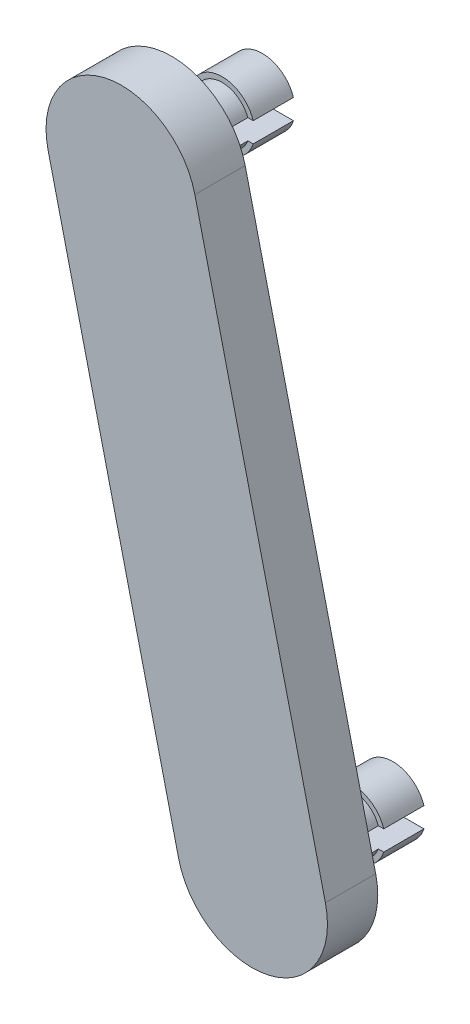
ISO-10303-21;
HEADER;
FILE_DESCRIPTION(('STEP AP214'),'2;1');
FILE_NAME('part.step','',(''),(''),'','','');
FILE_SCHEMA(('AUTOMOTIVE_DESIGN { 1 0 10303 214 1 1 1 1 }'));
ENDSEC;
DATA;
#1=APPLICATION_CONTEXT('core data for automotive mechanical design processes');
#2=APPLICATION_PROTOCOL_DEFINITION('international standard','automotive_design',2000,#1);
#3=PRODUCT_CONTEXT('',#1,'mechanical');
#4=PRODUCT('Part','Part','',(#3));
#5=PRODUCT_RELATED_PRODUCT_CATEGORY('part','',(#4));
#6=PRODUCT_DEFINITION_FORMATION('','',#4);
#7=PRODUCT_DEFINITION_CONTEXT('part definition',#1,'design');
#8=PRODUCT_DEFINITION('design','',#6,#7);
#9=PRODUCT_DEFINITION_SHAPE('','',#8);
#10=(LENGTH_UNIT() NAMED_UNIT(*) SI_UNIT(.MILLI.,.METRE.));
#11=(NAMED_UNIT(*) PLANE_ANGLE_UNIT() SI_UNIT($,.RADIAN.));
#12=(NAMED_UNIT(*) SI_UNIT($,.STERADIAN.) SOLID_ANGLE_UNIT());
#13=UNCERTAINTY_MEASURE_WITH_UNIT(LENGTH_MEASURE(1.E-05),#10,'distance_accuracy_value','');
#14=(GEOMETRIC_REPRESENTATION_CONTEXT(3) GLOBAL_UNCERTAINTY_ASSIGNED_CONTEXT((#13)) GLOBAL_UNIT_ASSIGNED_CONTEXT((#10,
#11,#12)) REPRESENTATION_CONTEXT('',''));
#15=CARTESIAN_POINT('',(0.,0.,0.));
#16=DIRECTION('',(0.,0.,1.));
#17=DIRECTION('',(1.,0.,0.));
#18=AXIS2_PLACEMENT_3D('',#15,#16,#17);
#19=CARTESIAN_POINT('',(-117.560209615445,12.3494325880028,-5.));
#20=DIRECTION('',(0.,0.,1.));
#21=DIRECTION('',(1.,0.,0.));
#22=AXIS2_PLACEMENT_3D('',#19,#20,#21);
#23=CYLINDRICAL_SURFACE('',#22,2.75000000000001);
#24=DIRECTION('',(0.,0.,1.));
#25=VECTOR('',#24,1.);
#26=CARTESIAN_POINT('',(-120.121947306934,13.3494325880028,-5.));
#27=LINE('',#26,#25);
#28=CARTESIAN_POINT('',(-120.121947306934,13.3494325880028,0.));
#29=VERTEX_POINT('',#28);
#30=CARTESIAN_POINT('',(-120.121947306934,13.3494325880028,-5.));
#31=VERTEX_POINT('',#30);
#32=EDGE_CURVE('E194',#29,#31,#27,.F.);
#33=ORIENTED_EDGE('',*,*,#32,.F.);
#34=CARTESIAN_POINT('',(-117.560209615445,12.3494325880028,0.));
#35=DIRECTION('',(0.,0.,1.));
#36=DIRECTION('',(1.,0.,0.));
#37=AXIS2_PLACEMENT_3D('',#34,#35,#36);
#38=CIRCLE('',#37,2.75000000000001);
#39=CARTESIAN_POINT('',(-114.998471923955,13.3494325880028,0.));
#40=VERTEX_POINT('',#39);
#41=EDGE_CURVE('E224',#40,#29,#38,.T.);
#42=ORIENTED_EDGE('',*,*,#41,.F.);
#43=DIRECTION('',(0.,0.,1.));
#44=VECTOR('',#43,1.);
#45=CARTESIAN_POINT('',(-114.998471923955,13.3494325880028,-5.));
#46=LINE('',#45,#44);
#47=CARTESIAN_POINT('',(-114.998471923955,13.3494325880028,-5.));
#48=VERTEX_POINT('',#47);
#49=EDGE_CURVE('E305',#48,#40,#46,.T.);
#50=ORIENTED_EDGE('',*,*,#49,.F.);
#51=CARTESIAN_POINT('',(-117.560209615445,12.3494325880028,-5.));
#52=DIRECTION('',(0.,0.,1.));
#53=DIRECTION('',(1.,0.,0.));
#54=AXIS2_PLACEMENT_3D('',#51,#52,#53);
#55=CIRCLE('',#54,2.75000000000001);
#56=EDGE_CURVE('E221',#48,#31,#55,.T.);
#57=ORIENTED_EDGE('',*,*,#56,.T.);
#58=EDGE_LOOP('',(#33,#42,#50,#57));
#59=FACE_BOUND('',#58,.T.);
#60=ADVANCED_FACE('F37',(#59),#23,.T.);
#61=CARTESIAN_POINT('',(-104.585156134855,-42.1266905043745,-5.));
#62=DIRECTION('',(0.,0.,1.));
#63=DIRECTION('',(1.,0.,0.));
#64=AXIS2_PLACEMENT_3D('',#61,#62,#63);
#65=CYLINDRICAL_SURFACE('',#64,2.75000000000001);
#66=DIRECTION('',(0.,0.,1.));
#67=VECTOR('',#66,1.);
#68=CARTESIAN_POINT('',(-107.146893826345,-41.1266905043745,-5.));
#69=LINE('',#68,#67);
#70=CARTESIAN_POINT('',(-107.146893826345,-41.1266905043745,0.));
#71=VERTEX_POINT('',#70);
#72=CARTESIAN_POINT('',(-107.146893826345,-41.1266905043745,-5.));
#73=VERTEX_POINT('',#72);
#74=EDGE_CURVE('E282',#71,#73,#69,.F.);
#75=ORIENTED_EDGE('',*,*,#74,.F.);
#76=CARTESIAN_POINT('',(-104.585156134855,-42.1266905043745,0.));
#77=DIRECTION('',(0.,0.,1.));
#78=DIRECTION('',(1.,0.,0.));
#79=AXIS2_PLACEMENT_3D('',#76,#77,#78);
#80=CIRCLE('',#79,2.75000000000001);
#81=CARTESIAN_POINT('',(-102.023418443365,-41.1266905043745,0.));
#82=VERTEX_POINT('',#81);
#83=EDGE_CURVE('E212',#82,#71,#80,.T.);
#84=ORIENTED_EDGE('',*,*,#83,.F.);
#85=DIRECTION('',(0.,0.,1.));
#86=VECTOR('',#85,1.);
#87=CARTESIAN_POINT('',(-102.023418443365,-41.1266905043745,-5.));
#88=LINE('',#87,#86);
#89=CARTESIAN_POINT('',(-102.023418443365,-41.1266905043745,-5.));
#90=VERTEX_POINT('',#89);
#91=EDGE_CURVE('E283',#90,#82,#88,.T.);
#92=ORIENTED_EDGE('',*,*,#91,.F.);
#93=CARTESIAN_POINT('',(-104.585156134855,-42.1266905043745,-5.));
#94=DIRECTION('',(0.,0.,1.));
#95=DIRECTION('',(1.,0.,0.));
#96=AXIS2_PLACEMENT_3D('',#93,#94,#95);
#97=CIRCLE('',#96,2.75000000000001);
#98=EDGE_CURVE('E217',#90,#73,#97,.T.);
#99=ORIENTED_EDGE('',*,*,#98,.T.);
#100=EDGE_LOOP('',(#75,#84,#92,#99));
#101=FACE_BOUND('',#100,.T.);
#102=ADVANCED_FACE('F280',(#101),#65,.T.);
#103=CARTESIAN_POINT('',(-117.560209615445,12.3494325880028,-9.));
#104=DIRECTION('',(0.,0.,1.));
#105=DIRECTION('',(1.,0.,0.));
#106=AXIS2_PLACEMENT_3D('',#103,#104,#105);
#107=CYLINDRICAL_SURFACE('',#106,3.25000000000001);
#108=CARTESIAN_POINT('',(-117.560209615445,12.3494325880028,-9.));
#109=DIRECTION('',(0.,0.,-1.));
#110=DIRECTION('',(-1.,0.,0.));
#111=AXIS2_PLACEMENT_3D('',#108,#109,#110);
#112=CIRCLE('',#111,3.25000000000001);
#113=CARTESIAN_POINT('',(-120.652538834658,13.3494325880028,-9.));
#114=VERTEX_POINT('',#113);
#115=CARTESIAN_POINT('',(-114.467880396231,13.3494325880028,-9.));
#116=VERTEX_POINT('',#115);
#117=EDGE_CURVE('E203',#114,#116,#112,.T.);
#118=ORIENTED_EDGE('',*,*,#117,.F.);
#119=DIRECTION('',(0.,0.,1.));
#120=VECTOR('',#119,1.);
#121=CARTESIAN_POINT('',(-120.652538834658,13.3494325880028,-9.));
#122=LINE('',#121,#120);
#123=CARTESIAN_POINT('',(-120.652538834658,13.3494325880028,-5.));
#124=VERTEX_POINT('',#123);
#125=EDGE_CURVE('E198',#114,#124,#122,.T.);
#126=ORIENTED_EDGE('',*,*,#125,.T.);
#127=CARTESIAN_POINT('',(-117.560209615445,12.3494325880028,-5.));
#128=DIRECTION('',(0.,0.,-1.));
#129=DIRECTION('',(-1.,0.,0.));
#130=AXIS2_PLACEMENT_3D('',#127,#128,#129);
#131=CIRCLE('',#130,3.25000000000001);
#132=CARTESIAN_POINT('',(-114.467880396231,13.3494325880028,-5.));
#133=VERTEX_POINT('',#132);
#134=EDGE_CURVE('E208',#124,#133,#131,.T.);
#135=ORIENTED_EDGE('',*,*,#134,.T.);
#136=DIRECTION('',(0.,0.,1.));
#137=VECTOR('',#136,1.);
#138=CARTESIAN_POINT('',(-114.467880396231,13.3494325880028,-9.));
#139=LINE('',#138,#137);
#140=EDGE_CURVE('E302',#133,#116,#139,.F.);
#141=ORIENTED_EDGE('',*,*,#140,.T.);
#142=EDGE_LOOP('',(#118,#126,#135,#141));
#143=FACE_BOUND('',#142,.T.);
#144=ADVANCED_FACE('F311',(#143),#107,.T.);
#145=CARTESIAN_POINT('',(-117.560209615445,12.3494325880028,-9.));
#146=DIRECTION('',(0.,0.,-1.));
#147=DIRECTION('',(-1.,0.,0.));
#148=AXIS2_PLACEMENT_3D('',#145,#146,#147);
#149=PLANE('',#148);
#150=DIRECTION('',(1.,0.,0.));
#151=VECTOR('',#150,1.);
#152=CARTESIAN_POINT('',(-112.560209615444,13.3494325880028,-9.));
#153=LINE('',#152,#151);
#154=EDGE_CURVE('E331',#114,#116,#153,.T.);
#155=ORIENTED_EDGE('',*,*,#154,.F.);
#156=ORIENTED_EDGE('',*,*,#117,.T.);
#157=EDGE_LOOP('',(#155,#156));
#158=FACE_BOUND('',#157,.T.);
#159=ADVANCED_FACE('F371',(#158),#149,.T.);
#160=CARTESIAN_POINT('',(-117.560209615445,12.3494325880028,-5.));
#161=DIRECTION('',(0.,0.,-1.));
#162=DIRECTION('',(-1.,0.,0.));
#163=AXIS2_PLACEMENT_3D('',#160,#161,#162);
#164=PLANE('',#163);
#165=ORIENTED_EDGE('',*,*,#134,.F.);
#166=DIRECTION('',(1.,0.,0.));
#167=VECTOR('',#166,1.);
#168=CARTESIAN_POINT('',(-117.560209615445,13.3494325880028,-5.));
#169=LINE('',#168,#167);
#170=EDGE_CURVE('E11',#124,#31,#169,.T.);
#171=ORIENTED_EDGE('',*,*,#170,.T.);
#172=ORIENTED_EDGE('',*,*,#56,.F.);
#173=EDGE_CURVE('E41',#48,#133,#169,.T.);
#174=ORIENTED_EDGE('',*,*,#173,.T.);
#175=EDGE_LOOP('',(#165,#171,#172,#174));
#176=FACE_BOUND('',#175,.T.);
#177=ADVANCED_FACE('F316',(#176),#164,.F.);
#178=CARTESIAN_POINT('',(-104.585156134855,-42.1266905043745,-9.));
#179=DIRECTION('',(0.,0.,1.));
#180=DIRECTION('',(1.,0.,0.));
#181=AXIS2_PLACEMENT_3D('',#178,#179,#180);
#182=CYLINDRICAL_SURFACE('',#181,3.25000000000001);
#183=CARTESIAN_POINT('',(-104.585156134855,-42.1266905043745,-9.));
#184=DIRECTION('',(0.,0.,-1.));
#185=DIRECTION('',(-1.,0.,0.));
#186=AXIS2_PLACEMENT_3D('',#183,#184,#185);
#187=CIRCLE('',#186,3.25000000000001);
#188=CARTESIAN_POINT('',(-107.677485354068,-41.1266905043745,-9.));
#189=VERTEX_POINT('',#188);
#190=CARTESIAN_POINT('',(-101.492826915642,-41.1266905043745,-9.));
#191=VERTEX_POINT('',#190);
#192=EDGE_CURVE('E193',#189,#191,#187,.T.);
#193=ORIENTED_EDGE('',*,*,#192,.F.);
#194=DIRECTION('',(0.,0.,1.));
#195=VECTOR('',#194,1.);
#196=CARTESIAN_POINT('',(-107.677485354068,-41.1266905043745,-9.));
#197=LINE('',#196,#195);
#198=CARTESIAN_POINT('',(-107.677485354068,-41.1266905043745,-5.));
#199=VERTEX_POINT('',#198);
#200=EDGE_CURVE('E285',#189,#199,#197,.T.);
#201=ORIENTED_EDGE('',*,*,#200,.T.);
#202=CARTESIAN_POINT('',(-104.585156134855,-42.1266905043745,-5.));
#203=DIRECTION('',(0.,0.,-1.));
#204=DIRECTION('',(-1.,0.,0.));
#205=AXIS2_PLACEMENT_3D('',#202,#203,#204);
#206=CIRCLE('',#205,3.25000000000001);
#207=CARTESIAN_POINT('',(-101.492826915642,-41.1266905043745,-5.));
#208=VERTEX_POINT('',#207);
#209=EDGE_CURVE('E202',#199,#208,#206,.T.);
#210=ORIENTED_EDGE('',*,*,#209,.T.);
#211=DIRECTION('',(0.,0.,1.));
#212=VECTOR('',#211,1.);
#213=CARTESIAN_POINT('',(-101.492826915642,-41.1266905043745,-9.));
#214=LINE('',#213,#212);
#215=EDGE_CURVE('E286',#208,#191,#214,.F.);
#216=ORIENTED_EDGE('',*,*,#215,.T.);
#217=EDGE_LOOP('',(#193,#201,#210,#216));
#218=FACE_BOUND('',#217,.T.);
#219=ADVANCED_FACE('F352',(#218),#182,.T.);
#220=CARTESIAN_POINT('',(-104.585156134855,-42.1266905043745,-9.));
#221=DIRECTION('',(0.,0.,-1.));
#222=DIRECTION('',(-1.,0.,0.));
#223=AXIS2_PLACEMENT_3D('',#220,#221,#222);
#224=PLANE('',#223);
#225=DIRECTION('',(1.,0.,0.));
#226=VECTOR('',#225,1.);
#227=CARTESIAN_POINT('',(-99.5851561348551,-41.1266905043745,-9.));
#228=LINE('',#227,#226);
#229=EDGE_CURVE('E189',#189,#191,#228,.T.);
#230=ORIENTED_EDGE('',*,*,#229,.F.);
#231=ORIENTED_EDGE('',*,*,#192,.T.);
#232=EDGE_LOOP('',(#230,#231));
#233=FACE_BOUND('',#232,.T.);
#234=ADVANCED_FACE('F356',(#233),#224,.T.);
#235=CARTESIAN_POINT('',(-104.585156134855,-42.1266905043745,-5.));
#236=DIRECTION('',(0.,0.,-1.));
#237=DIRECTION('',(-1.,0.,0.));
#238=AXIS2_PLACEMENT_3D('',#235,#236,#237);
#239=PLANE('',#238);
#240=ORIENTED_EDGE('',*,*,#209,.F.);
#241=DIRECTION('',(1.,0.,0.));
#242=VECTOR('',#241,1.);
#243=CARTESIAN_POINT('',(-104.585156134855,-41.1266905043745,-5.));
#244=LINE('',#243,#242);
#245=EDGE_CURVE('E261',#199,#73,#244,.T.);
#246=ORIENTED_EDGE('',*,*,#245,.T.);
#247=ORIENTED_EDGE('',*,*,#98,.F.);
#248=EDGE_CURVE('E259',#90,#208,#244,.T.);
#249=ORIENTED_EDGE('',*,*,#248,.T.);
#250=EDGE_LOOP('',(#240,#246,#247,#249));
#251=FACE_BOUND('',#250,.T.);
#252=ADVANCED_FACE('F273',(#251),#239,.F.);
#253=CARTESIAN_POINT('',(-104.585156134855,-42.1266905043745,5.));
#254=DIRECTION('',(0.,0.,-1.));
#255=DIRECTION('',(-1.,0.,0.));
#256=AXIS2_PLACEMENT_3D('',#253,#254,#255);
#257=CYLINDRICAL_SURFACE('',#256,7.50000000000001);
#258=CARTESIAN_POINT('',(-104.585156134855,-42.1266905043745,0.));
#259=DIRECTION('',(0.,0.,1.));
#260=DIRECTION('',(1.,0.,0.));
#261=AXIS2_PLACEMENT_3D('',#258,#259,#260);
#262=CIRCLE('',#261,7.50000000000001);
#263=CARTESIAN_POINT('',(-111.881065477584,-43.8644208812392,0.));
#264=VERTEX_POINT('',#263);
#265=CARTESIAN_POINT('',(-97.289246792126,-40.3889601275099,0.));
#266=VERTEX_POINT('',#265);
#267=EDGE_CURVE('E227',#264,#266,#262,.T.);
#268=ORIENTED_EDGE('',*,*,#267,.T.);
#269=DIRECTION('',(0.,0.,-1.));
#270=VECTOR('',#269,1.);
#271=CARTESIAN_POINT('',(-97.289246792126,-40.3889601275099,5.));
#272=LINE('',#271,#270);
#273=CARTESIAN_POINT('',(-97.289246792126,-40.3889601275099,5.));
#274=VERTEX_POINT('',#273);
#275=EDGE_CURVE('E254',#274,#266,#272,.T.);
#276=ORIENTED_EDGE('',*,*,#275,.F.);
#277=CARTESIAN_POINT('',(-104.585156134855,-42.1266905043745,5.));
#278=DIRECTION('',(0.,0.,1.));
#279=DIRECTION('',(1.,0.,0.));
#280=AXIS2_PLACEMENT_3D('',#277,#278,#279);
#281=CIRCLE('',#280,7.50000000000001);
#282=CARTESIAN_POINT('',(-111.881065477584,-43.8644208812392,5.));
#283=VERTEX_POINT('',#282);
#284=EDGE_CURVE('E228',#283,#274,#281,.T.);
#285=ORIENTED_EDGE('',*,*,#284,.F.);
#286=DIRECTION('',(0.,0.,-1.));
#287=VECTOR('',#286,1.);
#288=CARTESIAN_POINT('',(-111.881065477584,-43.8644208812392,5.));
#289=LINE('',#288,#287);
#290=EDGE_CURVE('E238',#283,#264,#289,.T.);
#291=ORIENTED_EDGE('',*,*,#290,.T.);
#292=EDGE_LOOP('',(#268,#276,#285,#291));
#293=FACE_BOUND('',#292,.T.);
#294=ADVANCED_FACE('F39',(#293),#257,.T.);
#295=CARTESIAN_POINT('',(-97.289246792126,-40.3889601275099,5.));
#296=DIRECTION('',(-0.972787912363881,-0.231697383581953,0.));
#297=DIRECTION('',(0.231697383581953,-0.972787912363881,0.));
#298=AXIS2_PLACEMENT_3D('',#295,#296,#297);
#299=PLANE('',#298);
#300=DIRECTION('',(-0.231697383581953,0.972787912363881,0.));
#301=VECTOR('',#300,1.);
#302=CARTESIAN_POINT('',(-97.289246792126,-40.3889601275099,0.));
#303=LINE('',#302,#301);
#304=CARTESIAN_POINT('',(-110.264300272715,14.0871629648674,0.));
#305=VERTEX_POINT('',#304);
#306=EDGE_CURVE('E241',#266,#305,#303,.T.);
#307=ORIENTED_EDGE('',*,*,#306,.T.);
#308=DIRECTION('',(0.,0.,-1.));
#309=VECTOR('',#308,1.);
#310=CARTESIAN_POINT('',(-110.264300272715,14.0871629648674,5.));
#311=LINE('',#310,#309);
#312=CARTESIAN_POINT('',(-110.264300272715,14.0871629648674,5.));
#313=VERTEX_POINT('',#312);
#314=EDGE_CURVE('E251',#313,#305,#311,.T.);
#315=ORIENTED_EDGE('',*,*,#314,.F.);
#316=DIRECTION('',(-0.231697383581953,0.972787912363881,0.));
#317=VECTOR('',#316,1.);
#318=CARTESIAN_POINT('',(-97.289246792126,-40.3889601275099,5.));
#319=LINE('',#318,#317);
#320=EDGE_CURVE('E231',#274,#313,#319,.T.);
#321=ORIENTED_EDGE('',*,*,#320,.F.);
#322=ORIENTED_EDGE('',*,*,#275,.T.);
#323=EDGE_LOOP('',(#307,#315,#321,#322));
#324=FACE_BOUND('',#323,.T.);
#325=ADVANCED_FACE('F420',(#324),#299,.F.);
#326=CARTESIAN_POINT('',(-117.560209615445,12.3494325880028,5.));
#327=DIRECTION('',(0.,0.,-1.));
#328=DIRECTION('',(-1.,0.,0.));
#329=AXIS2_PLACEMENT_3D('',#326,#327,#328);
#330=CYLINDRICAL_SURFACE('',#329,7.5);
#331=CARTESIAN_POINT('',(-117.560209615445,12.3494325880028,0.));
#332=DIRECTION('',(0.,0.,1.));
#333=DIRECTION('',(1.,0.,0.));
#334=AXIS2_PLACEMENT_3D('',#331,#332,#333);
#335=CIRCLE('',#334,7.5);
#336=CARTESIAN_POINT('',(-124.856118958174,10.6117022111381,0.));
#337=VERTEX_POINT('',#336);
#338=EDGE_CURVE('E243',#305,#337,#335,.T.);
#339=ORIENTED_EDGE('',*,*,#338,.T.);
#340=DIRECTION('',(0.,0.,-1.));
#341=VECTOR('',#340,1.);
#342=CARTESIAN_POINT('',(-124.856118958174,10.6117022111381,5.));
#343=LINE('',#342,#341);
#344=CARTESIAN_POINT('',(-124.856118958174,10.6117022111381,5.));
#345=VERTEX_POINT('',#344);
#346=EDGE_CURVE('E248',#345,#337,#343,.T.);
#347=ORIENTED_EDGE('',*,*,#346,.F.);
#348=CARTESIAN_POINT('',(-117.560209615445,12.3494325880028,5.));
#349=DIRECTION('',(0.,0.,1.));
#350=DIRECTION('',(1.,0.,0.));
#351=AXIS2_PLACEMENT_3D('',#348,#349,#350);
#352=CIRCLE('',#351,7.5);
#353=EDGE_CURVE('E234',#313,#345,#352,.T.);
#354=ORIENTED_EDGE('',*,*,#353,.F.);
#355=ORIENTED_EDGE('',*,*,#314,.T.);
#356=EDGE_LOOP('',(#339,#347,#354,#355));
#357=FACE_BOUND('',#356,.T.);
#358=ADVANCED_FACE('F417',(#357),#330,.T.);
#359=CARTESIAN_POINT('',(-111.881065477584,-43.8644208812392,5.));
#360=DIRECTION('',(0.972787912363881,0.231697383581953,0.));
#361=DIRECTION('',(-0.231697383581953,0.972787912363881,0.));
#362=AXIS2_PLACEMENT_3D('',#359,#360,#361);
#363=PLANE('',#362);
#364=DIRECTION('',(0.231697383581953,-0.972787912363881,0.));
#365=VECTOR('',#364,1.);
#366=CARTESIAN_POINT('',(-111.881065477584,-43.8644208812392,0.));
#367=LINE('',#366,#365);
#368=EDGE_CURVE('E232',#337,#264,#367,.T.);
#369=ORIENTED_EDGE('',*,*,#368,.T.);
#370=ORIENTED_EDGE('',*,*,#290,.F.);
#371=DIRECTION('',(0.231697383581953,-0.972787912363881,0.));
#372=VECTOR('',#371,1.);
#373=CARTESIAN_POINT('',(-111.881065477584,-43.8644208812392,5.));
#374=LINE('',#373,#372);
#375=EDGE_CURVE('E236',#345,#283,#374,.T.);
#376=ORIENTED_EDGE('',*,*,#375,.F.);
#377=ORIENTED_EDGE('',*,*,#346,.T.);
#378=EDGE_LOOP('',(#369,#370,#376,#377));
#379=FACE_BOUND('',#378,.T.);
#380=ADVANCED_FACE('F413',(#379),#363,.F.);
#381=CARTESIAN_POINT('',(-104.585156134855,-42.1266905043745,5.));
#382=DIRECTION('',(0.,0.,1.));
#383=DIRECTION('',(1.,0.,0.));
#384=AXIS2_PLACEMENT_3D('',#381,#382,#383);
#385=PLANE('',#384);
#386=ORIENTED_EDGE('',*,*,#284,.T.);
#387=ORIENTED_EDGE('',*,*,#320,.T.);
#388=ORIENTED_EDGE('',*,*,#353,.T.);
#389=ORIENTED_EDGE('',*,*,#375,.T.);
#390=EDGE_LOOP('',(#386,#387,#388,#389));
#391=FACE_BOUND('',#390,.T.);
#392=ADVANCED_FACE('F395',(#391),#385,.T.);
#393=CARTESIAN_POINT('',(-104.585156134855,-42.1266905043745,0.));
#394=DIRECTION('',(0.,0.,1.));
#395=DIRECTION('',(1.,0.,0.));
#396=AXIS2_PLACEMENT_3D('',#393,#394,#395);
#397=PLANE('',#396);
#398=DIRECTION('',(1.,0.,0.));
#399=VECTOR('',#398,1.);
#400=CARTESIAN_POINT('',(-99.5851561348551,-41.1266905043745,0.));
#401=LINE('',#400,#399);
#402=EDGE_CURVE('E337',#71,#82,#401,.T.);
#403=ORIENTED_EDGE('',*,*,#402,.T.);
#404=ORIENTED_EDGE('',*,*,#83,.T.);
#405=EDGE_LOOP('',(#403,#404));
#406=FACE_BOUND('',#405,.T.);
#407=DIRECTION('',(-1.,0.,0.));
#408=VECTOR('',#407,1.);
#409=CARTESIAN_POINT('',(-99.5851561348551,-43.1266905043745,0.));
#410=LINE('',#409,#408);
#411=CARTESIAN_POINT('',(-102.023418443365,-43.1266905043745,0.));
#412=VERTEX_POINT('',#411);
#413=CARTESIAN_POINT('',(-107.146893826345,-43.1266905043745,0.));
#414=VERTEX_POINT('',#413);
#415=EDGE_CURVE('E340',#412,#414,#410,.T.);
#416=ORIENTED_EDGE('',*,*,#415,.T.);
#417=EDGE_CURVE('E216',#414,#412,#80,.T.);
#418=ORIENTED_EDGE('',*,*,#417,.T.);
#419=EDGE_LOOP('',(#416,#418));
#420=FACE_BOUND('',#419,.T.);
#421=DIRECTION('',(1.,0.,0.));
#422=VECTOR('',#421,1.);
#423=CARTESIAN_POINT('',(-112.560209615444,13.3494325880028,0.));
#424=LINE('',#423,#422);
#425=EDGE_CURVE('E327',#29,#40,#424,.T.);
#426=ORIENTED_EDGE('',*,*,#425,.T.);
#427=ORIENTED_EDGE('',*,*,#41,.T.);
#428=EDGE_LOOP('',(#426,#427));
#429=FACE_BOUND('',#428,.T.);
#430=DIRECTION('',(-1.,0.,0.));
#431=VECTOR('',#430,1.);
#432=CARTESIAN_POINT('',(-112.560209615444,11.3494325880028,0.));
#433=LINE('',#432,#431);
#434=CARTESIAN_POINT('',(-114.998471923955,11.3494325880028,0.));
#435=VERTEX_POINT('',#434);
#436=CARTESIAN_POINT('',(-120.121947306934,11.3494325880028,0.));
#437=VERTEX_POINT('',#436);
#438=EDGE_CURVE('E328',#435,#437,#433,.T.);
#439=ORIENTED_EDGE('',*,*,#438,.T.);
#440=EDGE_CURVE('E215',#437,#435,#38,.T.);
#441=ORIENTED_EDGE('',*,*,#440,.T.);
#442=EDGE_LOOP('',(#439,#441));
#443=FACE_BOUND('',#442,.T.);
#444=ORIENTED_EDGE('',*,*,#267,.F.);
#445=ORIENTED_EDGE('',*,*,#368,.F.);
#446=ORIENTED_EDGE('',*,*,#338,.F.);
#447=ORIENTED_EDGE('',*,*,#306,.F.);
#448=EDGE_LOOP('',(#444,#445,#446,#447));
#449=FACE_BOUND('',#448,.T.);
#450=ADVANCED_FACE('F325',(#406,#420,#429,#443,#449),#397,.F.);
#451=DIRECTION('',(0.,0.,1.));
#452=VECTOR('',#451,1.);
#453=CARTESIAN_POINT('',(-114.998471923955,11.3494325880028,-5.));
#454=LINE('',#453,#452);
#455=CARTESIAN_POINT('',(-114.998471923955,11.3494325880028,-5.));
#456=VERTEX_POINT('',#455);
#457=EDGE_CURVE('E300',#435,#456,#454,.F.);
#458=ORIENTED_EDGE('',*,*,#457,.F.);
#459=ORIENTED_EDGE('',*,*,#440,.F.);
#460=DIRECTION('',(0.,0.,1.));
#461=VECTOR('',#460,1.);
#462=CARTESIAN_POINT('',(-120.121947306934,11.3494325880028,-5.));
#463=LINE('',#462,#461);
#464=CARTESIAN_POINT('',(-120.121947306934,11.3494325880028,-5.));
#465=VERTEX_POINT('',#464);
#466=EDGE_CURVE('E295',#465,#437,#463,.T.);
#467=ORIENTED_EDGE('',*,*,#466,.F.);
#468=EDGE_CURVE('E206',#465,#456,#55,.T.);
#469=ORIENTED_EDGE('',*,*,#468,.T.);
#470=EDGE_LOOP('',(#458,#459,#467,#469));
#471=FACE_BOUND('',#470,.T.);
#472=ADVANCED_FACE('F383',(#471),#23,.T.);
#473=DIRECTION('',(0.,0.,1.));
#474=VECTOR('',#473,1.);
#475=CARTESIAN_POINT('',(-102.023418443365,-43.1266905043745,-5.));
#476=LINE('',#475,#474);
#477=CARTESIAN_POINT('',(-102.023418443365,-43.1266905043745,-5.));
#478=VERTEX_POINT('',#477);
#479=EDGE_CURVE('E182',#412,#478,#476,.F.);
#480=ORIENTED_EDGE('',*,*,#479,.F.);
#481=ORIENTED_EDGE('',*,*,#417,.F.);
#482=DIRECTION('',(0.,0.,1.));
#483=VECTOR('',#482,1.);
#484=CARTESIAN_POINT('',(-107.146893826345,-43.1266905043745,-5.));
#485=LINE('',#484,#483);
#486=CARTESIAN_POINT('',(-107.146893826345,-43.1266905043745,-5.));
#487=VERTEX_POINT('',#486);
#488=EDGE_CURVE('E183',#487,#414,#485,.T.);
#489=ORIENTED_EDGE('',*,*,#488,.F.);
#490=EDGE_CURVE('E220',#487,#478,#97,.T.);
#491=ORIENTED_EDGE('',*,*,#490,.T.);
#492=EDGE_LOOP('',(#480,#481,#489,#491));
#493=FACE_BOUND('',#492,.T.);
#494=ADVANCED_FACE('F349',(#493),#65,.T.);
#495=CARTESIAN_POINT('',(-114.467880396231,11.3494325880028,-9.));
#496=VERTEX_POINT('',#495);
#497=CARTESIAN_POINT('',(-120.652538834658,11.3494325880028,-9.));
#498=VERTEX_POINT('',#497);
#499=EDGE_CURVE('E207',#496,#498,#112,.T.);
#500=ORIENTED_EDGE('',*,*,#499,.F.);
#501=DIRECTION('',(0.,0.,1.));
#502=VECTOR('',#501,1.);
#503=CARTESIAN_POINT('',(-114.467880396231,11.3494325880028,-9.));
#504=LINE('',#503,#502);
#505=CARTESIAN_POINT('',(-114.467880396231,11.3494325880028,-5.));
#506=VERTEX_POINT('',#505);
#507=EDGE_CURVE('E297',#496,#506,#504,.T.);
#508=ORIENTED_EDGE('',*,*,#507,.T.);
#509=CARTESIAN_POINT('',(-120.652538834658,11.3494325880028,-5.));
#510=VERTEX_POINT('',#509);
#511=EDGE_CURVE('E211',#506,#510,#131,.T.);
#512=ORIENTED_EDGE('',*,*,#511,.T.);
#513=DIRECTION('',(0.,0.,1.));
#514=VECTOR('',#513,1.);
#515=CARTESIAN_POINT('',(-120.652538834658,11.3494325880028,-9.));
#516=LINE('',#515,#514);
#517=EDGE_CURVE('E52',#510,#498,#516,.F.);
#518=ORIENTED_EDGE('',*,*,#517,.T.);
#519=EDGE_LOOP('',(#500,#508,#512,#518));
#520=FACE_BOUND('',#519,.T.);
#521=ADVANCED_FACE('F366',(#520),#107,.T.);
#522=DIRECTION('',(-1.,0.,0.));
#523=VECTOR('',#522,1.);
#524=CARTESIAN_POINT('',(-112.560209615444,11.3494325880028,-9.));
#525=LINE('',#524,#523);
#526=EDGE_CURVE('E190',#496,#498,#525,.T.);
#527=ORIENTED_EDGE('',*,*,#526,.F.);
#528=ORIENTED_EDGE('',*,*,#499,.T.);
#529=EDGE_LOOP('',(#527,#528));
#530=FACE_BOUND('',#529,.T.);
#531=ADVANCED_FACE('F367',(#530),#149,.T.);
#532=ORIENTED_EDGE('',*,*,#511,.F.);
#533=DIRECTION('',(-1.,0.,0.));
#534=VECTOR('',#533,1.);
#535=CARTESIAN_POINT('',(-117.560209615445,11.3494325880028,-5.));
#536=LINE('',#535,#534);
#537=EDGE_CURVE('E263',#506,#456,#536,.T.);
#538=ORIENTED_EDGE('',*,*,#537,.T.);
#539=ORIENTED_EDGE('',*,*,#468,.F.);
#540=EDGE_CURVE('E262',#465,#510,#536,.T.);
#541=ORIENTED_EDGE('',*,*,#540,.T.);
#542=EDGE_LOOP('',(#532,#538,#539,#541));
#543=FACE_BOUND('',#542,.T.);
#544=ADVANCED_FACE('F369',(#543),#164,.F.);
#545=CARTESIAN_POINT('',(-101.492826915642,-43.1266905043745,-9.));
#546=VERTEX_POINT('',#545);
#547=CARTESIAN_POINT('',(-107.677485354068,-43.1266905043745,-9.));
#548=VERTEX_POINT('',#547);
#549=EDGE_CURVE('E188',#546,#548,#187,.T.);
#550=ORIENTED_EDGE('',*,*,#549,.F.);
#551=DIRECTION('',(0.,0.,1.));
#552=VECTOR('',#551,1.);
#553=CARTESIAN_POINT('',(-101.492826915642,-43.1266905043745,-9.));
#554=LINE('',#553,#552);
#555=CARTESIAN_POINT('',(-101.492826915642,-43.1266905043745,-5.));
#556=VERTEX_POINT('',#555);
#557=EDGE_CURVE('E172',#546,#556,#554,.T.);
#558=ORIENTED_EDGE('',*,*,#557,.T.);
#559=CARTESIAN_POINT('',(-107.677485354068,-43.1266905043745,-5.));
#560=VERTEX_POINT('',#559);
#561=EDGE_CURVE('E197',#556,#560,#206,.T.);
#562=ORIENTED_EDGE('',*,*,#561,.T.);
#563=DIRECTION('',(0.,0.,1.));
#564=VECTOR('',#563,1.);
#565=CARTESIAN_POINT('',(-107.677485354068,-43.1266905043745,-9.));
#566=LINE('',#565,#564);
#567=EDGE_CURVE('E60',#560,#548,#566,.F.);
#568=ORIENTED_EDGE('',*,*,#567,.T.);
#569=EDGE_LOOP('',(#550,#558,#562,#568));
#570=FACE_BOUND('',#569,.T.);
#571=ADVANCED_FACE('F192',(#570),#182,.T.);
#572=DIRECTION('',(-1.,0.,0.));
#573=VECTOR('',#572,1.);
#574=CARTESIAN_POINT('',(-99.5851561348551,-43.1266905043745,-9.));
#575=LINE('',#574,#573);
#576=EDGE_CURVE('E175',#546,#548,#575,.T.);
#577=ORIENTED_EDGE('',*,*,#576,.F.);
#578=ORIENTED_EDGE('',*,*,#549,.T.);
#579=EDGE_LOOP('',(#577,#578));
#580=FACE_BOUND('',#579,.T.);
#581=ADVANCED_FACE('F187',(#580),#224,.T.);
#582=ORIENTED_EDGE('',*,*,#561,.F.);
#583=DIRECTION('',(-1.,0.,0.));
#584=VECTOR('',#583,1.);
#585=CARTESIAN_POINT('',(-104.585156134855,-43.1266905043745,-5.));
#586=LINE('',#585,#584);
#587=EDGE_CURVE('E177',#556,#478,#586,.T.);
#588=ORIENTED_EDGE('',*,*,#587,.T.);
#589=ORIENTED_EDGE('',*,*,#490,.F.);
#590=EDGE_CURVE('E257',#487,#560,#586,.T.);
#591=ORIENTED_EDGE('',*,*,#590,.T.);
#592=EDGE_LOOP('',(#582,#588,#589,#591));
#593=FACE_BOUND('',#592,.T.);
#594=ADVANCED_FACE('F347',(#593),#239,.F.);
#595=CARTESIAN_POINT('',(-99.5851561348551,-41.1266905043745,0.));
#596=DIRECTION('',(0.,1.,0.));
#597=DIRECTION('',(0.,0.,1.));
#598=AXIS2_PLACEMENT_3D('',#595,#596,#597);
#599=PLANE('',#598);
#600=ORIENTED_EDGE('',*,*,#74,.T.);
#601=ORIENTED_EDGE('',*,*,#245,.F.);
#602=ORIENTED_EDGE('',*,*,#200,.F.);
#603=ORIENTED_EDGE('',*,*,#229,.T.);
#604=ORIENTED_EDGE('',*,*,#215,.F.);
#605=ORIENTED_EDGE('',*,*,#248,.F.);
#606=ORIENTED_EDGE('',*,*,#91,.T.);
#607=ORIENTED_EDGE('',*,*,#402,.F.);
#608=EDGE_LOOP('',(#600,#601,#602,#603,#604,#605,#606,#607));
#609=FACE_BOUND('',#608,.T.);
#610=ADVANCED_FACE('F354',(#609),#599,.F.);
#611=CARTESIAN_POINT('',(-99.5851561348551,-43.1266905043745,0.));
#612=DIRECTION('',(0.,-1.,0.));
#613=DIRECTION('',(0.,0.,-1.));
#614=AXIS2_PLACEMENT_3D('',#611,#612,#613);
#615=PLANE('',#614);
#616=ORIENTED_EDGE('',*,*,#479,.T.);
#617=ORIENTED_EDGE('',*,*,#587,.F.);
#618=ORIENTED_EDGE('',*,*,#557,.F.);
#619=ORIENTED_EDGE('',*,*,#576,.T.);
#620=ORIENTED_EDGE('',*,*,#567,.F.);
#621=ORIENTED_EDGE('',*,*,#590,.F.);
#622=ORIENTED_EDGE('',*,*,#488,.T.);
#623=ORIENTED_EDGE('',*,*,#415,.F.);
#624=EDGE_LOOP('',(#616,#617,#618,#619,#620,#621,#622,#623));
#625=FACE_BOUND('',#624,.T.);
#626=ADVANCED_FACE('F174',(#625),#615,.F.);
#627=CARTESIAN_POINT('',(-112.560209615444,13.3494325880028,0.));
#628=DIRECTION('',(0.,1.,0.));
#629=DIRECTION('',(0.,0.,1.));
#630=AXIS2_PLACEMENT_3D('',#627,#628,#629);
#631=PLANE('',#630);
#632=ORIENTED_EDGE('',*,*,#32,.T.);
#633=ORIENTED_EDGE('',*,*,#170,.F.);
#634=ORIENTED_EDGE('',*,*,#125,.F.);
#635=ORIENTED_EDGE('',*,*,#154,.T.);
#636=ORIENTED_EDGE('',*,*,#140,.F.);
#637=ORIENTED_EDGE('',*,*,#173,.F.);
#638=ORIENTED_EDGE('',*,*,#49,.T.);
#639=ORIENTED_EDGE('',*,*,#425,.F.);
#640=EDGE_LOOP('',(#632,#633,#634,#635,#636,#637,#638,#639));
#641=FACE_BOUND('',#640,.T.);
#642=ADVANCED_FACE('F319',(#641),#631,.F.);
#643=CARTESIAN_POINT('',(-112.560209615444,11.3494325880028,0.));
#644=DIRECTION('',(0.,-1.,0.));
#645=DIRECTION('',(0.,0.,-1.));
#646=AXIS2_PLACEMENT_3D('',#643,#644,#645);
#647=PLANE('',#646);
#648=ORIENTED_EDGE('',*,*,#457,.T.);
#649=ORIENTED_EDGE('',*,*,#537,.F.);
#650=ORIENTED_EDGE('',*,*,#507,.F.);
#651=ORIENTED_EDGE('',*,*,#526,.T.);
#652=ORIENTED_EDGE('',*,*,#517,.F.);
#653=ORIENTED_EDGE('',*,*,#540,.F.);
#654=ORIENTED_EDGE('',*,*,#466,.T.);
#655=ORIENTED_EDGE('',*,*,#438,.F.);
#656=EDGE_LOOP('',(#648,#649,#650,#651,#652,#653,#654,#655));
#657=FACE_BOUND('',#656,.T.);
#658=ADVANCED_FACE('F361',(#657),#647,.F.);
#659=CLOSED_SHELL('',(#60,#102,#144,#159,#177,#219,#234,#252,#294,#325,#358,#380,#392,#450,#472,
#494,#521,#531,#544,#571,#581,#594,#610,#626,#642,#658));
#660=MANIFOLD_SOLID_BREP('B2',#659);
#661=ADVANCED_BREP_SHAPE_REPRESENTATION('',(#18,#660),#14);
#662=SHAPE_DEFINITION_REPRESENTATION(#9,#661);
ENDSEC;
END-ISO-10303-21;
